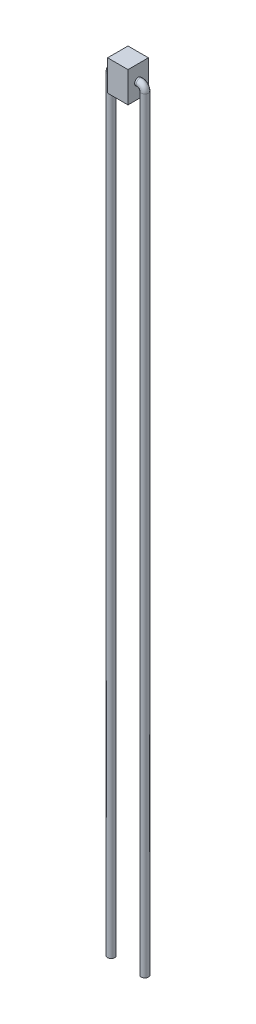
ISO-10303-21;
HEADER;
FILE_DESCRIPTION(('STEP AP214'),'2;1');
FILE_NAME('part.step','',(''),(''),'','','');
FILE_SCHEMA(('AUTOMOTIVE_DESIGN { 1 0 10303 214 1 1 1 1 }'));
ENDSEC;
DATA;
#1=APPLICATION_CONTEXT('core data for automotive mechanical design processes');
#2=APPLICATION_PROTOCOL_DEFINITION('international standard','automotive_design',2000,#1);
#3=PRODUCT_CONTEXT('',#1,'mechanical');
#4=PRODUCT('Part','Part','',(#3));
#5=PRODUCT_RELATED_PRODUCT_CATEGORY('part','',(#4));
#6=PRODUCT_DEFINITION_FORMATION('','',#4);
#7=PRODUCT_DEFINITION_CONTEXT('part definition',#1,'design');
#8=PRODUCT_DEFINITION('design','',#6,#7);
#9=PRODUCT_DEFINITION_SHAPE('','',#8);
#10=(LENGTH_UNIT() NAMED_UNIT(*) SI_UNIT(.MILLI.,.METRE.));
#11=(NAMED_UNIT(*) PLANE_ANGLE_UNIT() SI_UNIT($,.RADIAN.));
#12=(NAMED_UNIT(*) SI_UNIT($,.STERADIAN.) SOLID_ANGLE_UNIT());
#13=UNCERTAINTY_MEASURE_WITH_UNIT(LENGTH_MEASURE(1.E-05),#10,'distance_accuracy_value','');
#14=(GEOMETRIC_REPRESENTATION_CONTEXT(3) GLOBAL_UNCERTAINTY_ASSIGNED_CONTEXT((#13)) GLOBAL_UNIT_ASSIGNED_CONTEXT((#10,
#11,#12)) REPRESENTATION_CONTEXT('',''));
#15=CARTESIAN_POINT('',(0.,0.,0.));
#16=DIRECTION('',(0.,0.,1.));
#17=DIRECTION('',(1.,0.,0.));
#18=AXIS2_PLACEMENT_3D('',#15,#16,#17);
#19=CARTESIAN_POINT('',(1.,3.,1.));
#20=DIRECTION('',(-1.,0.,0.));
#21=DIRECTION('',(0.,0.,1.));
#22=AXIS2_PLACEMENT_3D('',#19,#20,#21);
#23=PLANE('',#22);
#24=CARTESIAN_POINT('',(1.,1.5,0.));
#25=DIRECTION('',(-1.,0.,0.));
#26=DIRECTION('',(0.,0.,1.));
#27=AXIS2_PLACEMENT_3D('',#24,#25,#26);
#28=CIRCLE('',#27,0.35);
#29=CARTESIAN_POINT('',(1.,1.5,0.35));
#30=VERTEX_POINT('',#29);
#31=EDGE_CURVE('E11',#30,#30,#28,.F.);
#32=ORIENTED_EDGE('',*,*,#31,.F.);
#33=EDGE_LOOP('',(#32));
#34=FACE_BOUND('',#33,.T.);
#35=DIRECTION('',(0.,0.,-1.));
#36=VECTOR('',#35,1.);
#37=CARTESIAN_POINT('',(1.,0.,1.));
#38=LINE('',#37,#36);
#39=CARTESIAN_POINT('',(1.,0.,1.));
#40=VERTEX_POINT('',#39);
#41=CARTESIAN_POINT('',(1.,0.,-1.));
#42=VERTEX_POINT('',#41);
#43=EDGE_CURVE('E116',#40,#42,#38,.T.);
#44=ORIENTED_EDGE('',*,*,#43,.T.);
#45=DIRECTION('',(0.,-1.,0.));
#46=VECTOR('',#45,1.);
#47=CARTESIAN_POINT('',(1.,3.,-1.));
#48=LINE('',#47,#46);
#49=CARTESIAN_POINT('',(1.,3.,-1.));
#50=VERTEX_POINT('',#49);
#51=EDGE_CURVE('E37',#50,#42,#48,.T.);
#52=ORIENTED_EDGE('',*,*,#51,.F.);
#53=DIRECTION('',(0.,0.,-1.));
#54=VECTOR('',#53,1.);
#55=CARTESIAN_POINT('',(1.,3.,1.));
#56=LINE('',#55,#54);
#57=CARTESIAN_POINT('',(1.,3.,1.));
#58=VERTEX_POINT('',#57);
#59=EDGE_CURVE('E119',#58,#50,#56,.T.);
#60=ORIENTED_EDGE('',*,*,#59,.F.);
#61=DIRECTION('',(0.,-1.,0.));
#62=VECTOR('',#61,1.);
#63=CARTESIAN_POINT('',(1.,3.,1.));
#64=LINE('',#63,#62);
#65=EDGE_CURVE('E125',#58,#40,#64,.T.);
#66=ORIENTED_EDGE('',*,*,#65,.T.);
#67=EDGE_LOOP('',(#44,#52,#60,#66));
#68=FACE_BOUND('',#67,.T.);
#69=ADVANCED_FACE('F34',(#34,#68),#23,.F.);
#70=CARTESIAN_POINT('',(-1.,3.,-1.));
#71=DIRECTION('',(0.,0.,1.));
#72=DIRECTION('',(1.,0.,0.));
#73=AXIS2_PLACEMENT_3D('',#70,#71,#72);
#74=PLANE('',#73);
#75=CARTESIAN_POINT('',(-0.45,1.50054588412287,-1.));
#76=DIRECTION('',(0.,0.,-1.));
#77=DIRECTION('',(-1.,0.,0.));
#78=AXIS2_PLACEMENT_3D('',#75,#76,#77);
#79=CIRCLE('',#78,0.5);
#80=CARTESIAN_POINT('',(-0.950000000000001,1.50054588412287,-1.));
#81=VERTEX_POINT('',#80);
#82=EDGE_CURVE('E112',#81,#81,#79,.T.);
#83=ORIENTED_EDGE('',*,*,#82,.F.);
#84=EDGE_LOOP('',(#83));
#85=FACE_BOUND('',#84,.T.);
#86=DIRECTION('',(-1.,0.,0.));
#87=VECTOR('',#86,1.);
#88=CARTESIAN_POINT('',(-1.,0.,-1.));
#89=LINE('',#88,#87);
#90=CARTESIAN_POINT('',(-1.,0.,-1.));
#91=VERTEX_POINT('',#90);
#92=EDGE_CURVE('E128',#42,#91,#89,.T.);
#93=ORIENTED_EDGE('',*,*,#92,.T.);
#94=DIRECTION('',(0.,-1.,0.));
#95=VECTOR('',#94,1.);
#96=CARTESIAN_POINT('',(-1.,3.,-1.));
#97=LINE('',#96,#95);
#98=CARTESIAN_POINT('',(-1.,3.,-1.));
#99=VERTEX_POINT('',#98);
#100=EDGE_CURVE('E134',#99,#91,#97,.T.);
#101=ORIENTED_EDGE('',*,*,#100,.F.);
#102=DIRECTION('',(-1.,0.,0.));
#103=VECTOR('',#102,1.);
#104=CARTESIAN_POINT('',(-1.,3.,-1.));
#105=LINE('',#104,#103);
#106=EDGE_CURVE('E84',#50,#99,#105,.T.);
#107=ORIENTED_EDGE('',*,*,#106,.F.);
#108=ORIENTED_EDGE('',*,*,#51,.T.);
#109=EDGE_LOOP('',(#93,#101,#107,#108));
#110=FACE_BOUND('',#109,.T.);
#111=ADVANCED_FACE('F137',(#85,#110),#74,.F.);
#112=CARTESIAN_POINT('',(-1.,3.,1.));
#113=DIRECTION('',(1.,0.,0.));
#114=DIRECTION('',(0.,0.,-1.));
#115=AXIS2_PLACEMENT_3D('',#112,#113,#114);
#116=PLANE('',#115);
#117=CARTESIAN_POINT('',(-1.,1.5,0.));
#118=DIRECTION('',(-1.,0.,0.));
#119=DIRECTION('',(0.,0.,1.));
#120=AXIS2_PLACEMENT_3D('',#117,#118,#119);
#121=CIRCLE('',#120,0.35);
#122=CARTESIAN_POINT('',(-1.,1.5,0.35));
#123=VERTEX_POINT('',#122);
#124=EDGE_CURVE('E43',#123,#123,#121,.T.);
#125=ORIENTED_EDGE('',*,*,#124,.F.);
#126=EDGE_LOOP('',(#125));
#127=FACE_BOUND('',#126,.T.);
#128=DIRECTION('',(0.,0.,1.));
#129=VECTOR('',#128,1.);
#130=CARTESIAN_POINT('',(-1.,0.,1.));
#131=LINE('',#130,#129);
#132=CARTESIAN_POINT('',(-1.,0.,1.));
#133=VERTEX_POINT('',#132);
#134=EDGE_CURVE('E70',#91,#133,#131,.T.);
#135=ORIENTED_EDGE('',*,*,#134,.T.);
#136=DIRECTION('',(0.,-1.,0.));
#137=VECTOR('',#136,1.);
#138=CARTESIAN_POINT('',(-1.,3.,1.));
#139=LINE('',#138,#137);
#140=CARTESIAN_POINT('',(-1.,3.,1.));
#141=VERTEX_POINT('',#140);
#142=EDGE_CURVE('E133',#141,#133,#139,.T.);
#143=ORIENTED_EDGE('',*,*,#142,.F.);
#144=DIRECTION('',(0.,0.,1.));
#145=VECTOR('',#144,1.);
#146=CARTESIAN_POINT('',(-1.,3.,1.));
#147=LINE('',#146,#145);
#148=EDGE_CURVE('E122',#99,#141,#147,.T.);
#149=ORIENTED_EDGE('',*,*,#148,.F.);
#150=ORIENTED_EDGE('',*,*,#100,.T.);
#151=EDGE_LOOP('',(#135,#143,#149,#150));
#152=FACE_BOUND('',#151,.T.);
#153=ADVANCED_FACE('F162',(#127,#152),#116,.F.);
#154=CARTESIAN_POINT('',(-1.,3.,1.));
#155=DIRECTION('',(0.,0.,-1.));
#156=DIRECTION('',(-1.,0.,0.));
#157=AXIS2_PLACEMENT_3D('',#154,#155,#156);
#158=PLANE('',#157);
#159=DIRECTION('',(1.,0.,0.));
#160=VECTOR('',#159,1.);
#161=CARTESIAN_POINT('',(-1.,0.,1.));
#162=LINE('',#161,#160);
#163=EDGE_CURVE('E76',#133,#40,#162,.T.);
#164=ORIENTED_EDGE('',*,*,#163,.T.);
#165=ORIENTED_EDGE('',*,*,#65,.F.);
#166=DIRECTION('',(1.,0.,0.));
#167=VECTOR('',#166,1.);
#168=CARTESIAN_POINT('',(-1.,3.,1.));
#169=LINE('',#168,#167);
#170=EDGE_CURVE('E52',#141,#58,#169,.T.);
#171=ORIENTED_EDGE('',*,*,#170,.F.);
#172=ORIENTED_EDGE('',*,*,#142,.T.);
#173=EDGE_LOOP('',(#164,#165,#171,#172));
#174=FACE_BOUND('',#173,.T.);
#175=ADVANCED_FACE('F154',(#174),#158,.F.);
#176=CARTESIAN_POINT('',(0.,3.,0.));
#177=DIRECTION('',(0.,-1.,0.));
#178=DIRECTION('',(0.,0.,-1.));
#179=AXIS2_PLACEMENT_3D('',#176,#177,#178);
#180=PLANE('',#179);
#181=ORIENTED_EDGE('',*,*,#59,.T.);
#182=ORIENTED_EDGE('',*,*,#106,.T.);
#183=ORIENTED_EDGE('',*,*,#148,.T.);
#184=ORIENTED_EDGE('',*,*,#170,.T.);
#185=EDGE_LOOP('',(#181,#182,#183,#184));
#186=FACE_BOUND('',#185,.T.);
#187=ADVANCED_FACE('F145',(#186),#180,.F.);
#188=CARTESIAN_POINT('',(0.,0.,0.));
#189=DIRECTION('',(0.,-1.,0.));
#190=DIRECTION('',(0.,0.,-1.));
#191=AXIS2_PLACEMENT_3D('',#188,#189,#190);
#192=PLANE('',#191);
#193=ORIENTED_EDGE('',*,*,#43,.F.);
#194=ORIENTED_EDGE('',*,*,#163,.F.);
#195=ORIENTED_EDGE('',*,*,#134,.F.);
#196=ORIENTED_EDGE('',*,*,#92,.F.);
#197=EDGE_LOOP('',(#193,#194,#195,#196));
#198=FACE_BOUND('',#197,.T.);
#199=ADVANCED_FACE('F142',(#198),#192,.T.);
#200=CARTESIAN_POINT('',(-0.45,1.50054588412287,-0.99));
#201=DIRECTION('',(0.,0.,-1.));
#202=DIRECTION('',(-1.,0.,0.));
#203=AXIS2_PLACEMENT_3D('',#200,#201,#202);
#204=CYLINDRICAL_SURFACE('',#203,0.5);
#205=CARTESIAN_POINT('',(-0.45,1.50054588412287,-0.99));
#206=DIRECTION('',(0.,0.,-1.));
#207=DIRECTION('',(-1.,0.,0.));
#208=AXIS2_PLACEMENT_3D('',#205,#206,#207);
#209=CIRCLE('',#208,0.5);
#210=CARTESIAN_POINT('',(-0.950000000000001,1.50054588412287,-0.99));
#211=VERTEX_POINT('',#210);
#212=EDGE_CURVE('E113',#211,#211,#209,.T.);
#213=ORIENTED_EDGE('',*,*,#212,.F.);
#214=EDGE_LOOP('',(#213));
#215=FACE_BOUND('',#214,.T.);
#216=ORIENTED_EDGE('',*,*,#82,.T.);
#217=EDGE_LOOP('',(#216));
#218=FACE_BOUND('',#217,.T.);
#219=ADVANCED_FACE('F144',(#215,#218),#204,.F.);
#220=CARTESIAN_POINT('',(-0.45,1.50054588412287,-0.99));
#221=DIRECTION('',(0.,0.,-1.));
#222=DIRECTION('',(-1.,0.,0.));
#223=AXIS2_PLACEMENT_3D('',#220,#221,#222);
#224=PLANE('',#223);
#225=ORIENTED_EDGE('',*,*,#212,.T.);
#226=EDGE_LOOP('',(#225));
#227=FACE_BOUND('',#226,.T.);
#228=ADVANCED_FACE('F151',(#227),#224,.T.);
#229=CARTESIAN_POINT('',(-1.65277616925856,-74.,0.));
#230=DIRECTION('',(0.,-1.,0.));
#231=DIRECTION('',(0.,0.,1.));
#232=AXIS2_PLACEMENT_3D('',#229,#230,#231);
#233=PLANE('',#232);
#234=CARTESIAN_POINT('',(-1.65277616925856,-74.,0.));
#235=DIRECTION('',(0.,-1.,0.));
#236=DIRECTION('',(0.,0.,1.));
#237=AXIS2_PLACEMENT_3D('',#234,#235,#236);
#238=CIRCLE('',#237,0.35);
#239=CARTESIAN_POINT('',(-1.65277616925856,-74.,0.35));
#240=VERTEX_POINT('',#239);
#241=EDGE_CURVE('E110',#240,#240,#238,.T.);
#242=ORIENTED_EDGE('',*,*,#241,.T.);
#243=EDGE_LOOP('',(#242));
#244=FACE_BOUND('',#243,.T.);
#245=ADVANCED_FACE('F183',(#244),#233,.T.);
#246=CARTESIAN_POINT('',(-1.,1.5,0.));
#247=DIRECTION('',(-1.,0.,0.));
#248=DIRECTION('',(0.,0.,1.));
#249=AXIS2_PLACEMENT_3D('',#246,#247,#248);
#250=CYLINDRICAL_SURFACE('',#249,0.35);
#251=CARTESIAN_POINT('',(-1.15277616925857,1.5,0.));
#252=DIRECTION('',(-1.,0.,0.));
#253=DIRECTION('',(0.,0.,1.));
#254=AXIS2_PLACEMENT_3D('',#251,#252,#253);
#255=CIRCLE('',#254,0.35);
#256=CARTESIAN_POINT('',(-1.15277616925857,1.85,0.));
#257=VERTEX_POINT('',#256);
#258=EDGE_CURVE('E95',#257,#257,#255,.T.);
#259=ORIENTED_EDGE('',*,*,#258,.F.);
#260=EDGE_LOOP('',(#259));
#261=FACE_BOUND('',#260,.T.);
#262=ORIENTED_EDGE('',*,*,#124,.T.);
#263=EDGE_LOOP('',(#262));
#264=FACE_BOUND('',#263,.T.);
#265=ADVANCED_FACE('F185',(#261,#264),#250,.T.);
#266=CARTESIAN_POINT('',(-1.15277616925857,1.,0.));
#267=DIRECTION('',(0.,0.,1.));
#268=DIRECTION('',(1.,0.,0.));
#269=AXIS2_PLACEMENT_3D('',#266,#267,#268);
#270=TOROIDAL_SURFACE('',#269,0.5,0.35);
#271=CARTESIAN_POINT('',(-1.65277616925857,1.,0.));
#272=DIRECTION('',(0.,-1.,0.));
#273=DIRECTION('',(0.,0.,1.));
#274=AXIS2_PLACEMENT_3D('',#271,#272,#273);
#275=CIRCLE('',#274,0.35);
#276=CARTESIAN_POINT('',(-2.00277616925857,1.,0.));
#277=VERTEX_POINT('',#276);
#278=EDGE_CURVE('E99',#277,#277,#275,.T.);
#279=CARTESIAN_POINT('',(-1.15277616925857,1.,0.));
#280=DIRECTION('',(0.,0.,1.));
#281=DIRECTION('',(1.,0.,0.));
#282=AXIS2_PLACEMENT_3D('',#279,#280,#281);
#283=CIRCLE('',#282,0.85);
#284=EDGE_CURVE('',#257,#277,#283,.T.);
#285=ORIENTED_EDGE('',*,*,#258,.T.);
#286=ORIENTED_EDGE('',*,*,#278,.F.);
#287=ORIENTED_EDGE('',*,*,#284,.T.);
#288=ORIENTED_EDGE('',*,*,#284,.F.);
#289=EDGE_LOOP('',(#285,#287,#286,#288));
#290=FACE_BOUND('',#289,.T.);
#291=ADVANCED_FACE('F188',(#290),#270,.T.);
#292=CARTESIAN_POINT('',(-1.65277616925857,1.,0.));
#293=DIRECTION('',(0.,-1.,0.));
#294=DIRECTION('',(1.,0.,0.));
#295=AXIS2_PLACEMENT_3D('',#292,#293,#294);
#296=CYLINDRICAL_SURFACE('',#295,0.35);
#297=ORIENTED_EDGE('',*,*,#241,.F.);
#298=EDGE_LOOP('',(#297));
#299=FACE_BOUND('',#298,.T.);
#300=ORIENTED_EDGE('',*,*,#278,.T.);
#301=EDGE_LOOP('',(#300));
#302=FACE_BOUND('',#301,.T.);
#303=ADVANCED_FACE('F178',(#299,#302),#296,.T.);
#304=CARTESIAN_POINT('',(1.65277616925856,-74.,0.));
#305=DIRECTION('',(0.,-1.,0.));
#306=DIRECTION('',(0.,0.,1.));
#307=AXIS2_PLACEMENT_3D('',#304,#305,#306);
#308=PLANE('',#307);
#309=CARTESIAN_POINT('',(1.65277616925856,-74.,0.));
#310=DIRECTION('',(0.,1.,0.));
#311=DIRECTION('',(0.,0.,1.));
#312=AXIS2_PLACEMENT_3D('',#309,#310,#311);
#313=CIRCLE('',#312,0.35);
#314=CARTESIAN_POINT('',(1.65277616925856,-74.,0.35));
#315=VERTEX_POINT('',#314);
#316=EDGE_CURVE('E92',#315,#315,#313,.F.);
#317=ORIENTED_EDGE('',*,*,#316,.T.);
#318=EDGE_LOOP('',(#317));
#319=FACE_BOUND('',#318,.T.);
#320=ADVANCED_FACE('F93',(#319),#308,.T.);
#321=CARTESIAN_POINT('',(1.,1.5,0.));
#322=DIRECTION('',(1.,0.,0.));
#323=DIRECTION('',(0.,0.,-1.));
#324=AXIS2_PLACEMENT_3D('',#321,#322,#323);
#325=CYLINDRICAL_SURFACE('',#324,0.35);
#326=CARTESIAN_POINT('',(1.15277616925857,1.5,0.));
#327=DIRECTION('',(-1.,0.,0.));
#328=DIRECTION('',(0.,0.,1.));
#329=AXIS2_PLACEMENT_3D('',#326,#327,#328);
#330=CIRCLE('',#329,0.35);
#331=CARTESIAN_POINT('',(1.15277616925857,1.85,0.));
#332=VERTEX_POINT('',#331);
#333=EDGE_CURVE('E102',#332,#332,#330,.F.);
#334=ORIENTED_EDGE('',*,*,#333,.F.);
#335=EDGE_LOOP('',(#334));
#336=FACE_BOUND('',#335,.T.);
#337=ORIENTED_EDGE('',*,*,#31,.T.);
#338=EDGE_LOOP('',(#337));
#339=FACE_BOUND('',#338,.T.);
#340=ADVANCED_FACE('F166',(#336,#339),#325,.T.);
#341=CARTESIAN_POINT('',(1.15277616925857,1.,0.));
#342=DIRECTION('',(0.,0.,-1.));
#343=DIRECTION('',(-1.,0.,0.));
#344=AXIS2_PLACEMENT_3D('',#341,#342,#343);
#345=TOROIDAL_SURFACE('',#344,0.5,0.35);
#346=CARTESIAN_POINT('',(1.65277616925857,1.,0.));
#347=DIRECTION('',(0.,1.,0.));
#348=DIRECTION('',(0.,0.,1.));
#349=AXIS2_PLACEMENT_3D('',#346,#347,#348);
#350=CIRCLE('',#349,0.35);
#351=CARTESIAN_POINT('',(2.00277616925857,1.,0.));
#352=VERTEX_POINT('',#351);
#353=EDGE_CURVE('E96',#352,#352,#350,.F.);
#354=CARTESIAN_POINT('',(1.15277616925857,1.,0.));
#355=DIRECTION('',(0.,0.,-1.));
#356=DIRECTION('',(-1.,0.,0.));
#357=AXIS2_PLACEMENT_3D('',#354,#355,#356);
#358=CIRCLE('',#357,0.85);
#359=EDGE_CURVE('',#332,#352,#358,.T.);
#360=ORIENTED_EDGE('',*,*,#333,.T.);
#361=ORIENTED_EDGE('',*,*,#353,.F.);
#362=ORIENTED_EDGE('',*,*,#359,.T.);
#363=ORIENTED_EDGE('',*,*,#359,.F.);
#364=EDGE_LOOP('',(#360,#362,#361,#363));
#365=FACE_BOUND('',#364,.T.);
#366=ADVANCED_FACE('F168',(#365),#345,.T.);
#367=CARTESIAN_POINT('',(1.65277616925857,1.,0.));
#368=DIRECTION('',(0.,-1.,0.));
#369=DIRECTION('',(1.,0.,0.));
#370=AXIS2_PLACEMENT_3D('',#367,#368,#369);
#371=CYLINDRICAL_SURFACE('',#370,0.35);
#372=ORIENTED_EDGE('',*,*,#316,.F.);
#373=EDGE_LOOP('',(#372));
#374=FACE_BOUND('',#373,.T.);
#375=ORIENTED_EDGE('',*,*,#353,.T.);
#376=EDGE_LOOP('',(#375));
#377=FACE_BOUND('',#376,.T.);
#378=ADVANCED_FACE('F175',(#374,#377),#371,.T.);
#379=CLOSED_SHELL('',(#69,#111,#153,#175,#187,#199,#219,#228,#245,#265,#291,#303,#320,#340,#366,#378));
#380=MANIFOLD_SOLID_BREP('B2',#379);
#381=ADVANCED_BREP_SHAPE_REPRESENTATION('',(#18,#380),#14);
#382=SHAPE_DEFINITION_REPRESENTATION(#9,#381);
ENDSEC;
END-ISO-10303-21;
